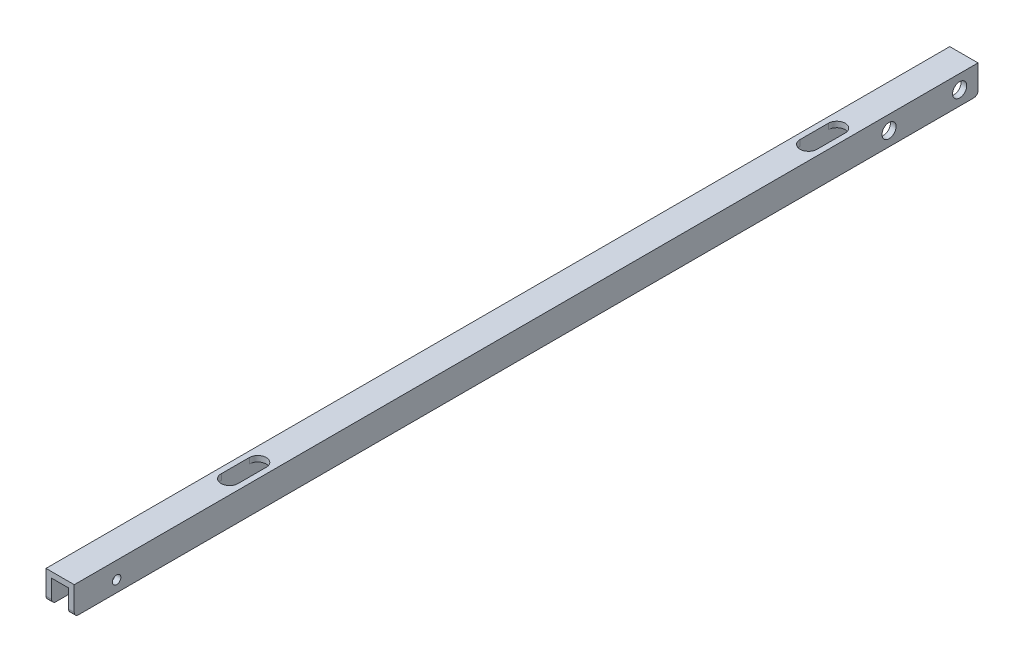
ISO-10303-21;
HEADER;
FILE_DESCRIPTION(('STEP AP214'),'2;1');
FILE_NAME('part.step','',(''),(''),'','','');
FILE_SCHEMA(('AUTOMOTIVE_DESIGN { 1 0 10303 214 1 1 1 1 }'));
ENDSEC;
DATA;
#1=APPLICATION_CONTEXT('core data for automotive mechanical design processes');
#2=APPLICATION_PROTOCOL_DEFINITION('international standard','automotive_design',2000,#1);
#3=PRODUCT_CONTEXT('',#1,'mechanical');
#4=PRODUCT('Part','Part','',(#3));
#5=PRODUCT_RELATED_PRODUCT_CATEGORY('part','',(#4));
#6=PRODUCT_DEFINITION_FORMATION('','',#4);
#7=PRODUCT_DEFINITION_CONTEXT('part definition',#1,'design');
#8=PRODUCT_DEFINITION('design','',#6,#7);
#9=PRODUCT_DEFINITION_SHAPE('','',#8);
#10=(LENGTH_UNIT() NAMED_UNIT(*) SI_UNIT(.MILLI.,.METRE.));
#11=(NAMED_UNIT(*) PLANE_ANGLE_UNIT() SI_UNIT($,.RADIAN.));
#12=(NAMED_UNIT(*) SI_UNIT($,.STERADIAN.) SOLID_ANGLE_UNIT());
#13=UNCERTAINTY_MEASURE_WITH_UNIT(LENGTH_MEASURE(1.E-05),#10,'distance_accuracy_value','');
#14=(GEOMETRIC_REPRESENTATION_CONTEXT(3) GLOBAL_UNCERTAINTY_ASSIGNED_CONTEXT((#13)) GLOBAL_UNIT_ASSIGNED_CONTEXT((#10,
#11,#12)) REPRESENTATION_CONTEXT('',''));
#15=CARTESIAN_POINT('',(0.,0.,0.));
#16=DIRECTION('',(0.,0.,1.));
#17=DIRECTION('',(1.,0.,0.));
#18=AXIS2_PLACEMENT_3D('',#15,#16,#17);
#19=CARTESIAN_POINT('',(0.,8.00000000000001,-400.));
#20=DIRECTION('',(0.,-1.,0.));
#21=DIRECTION('',(0.,0.,-1.));
#22=AXIS2_PLACEMENT_3D('',#19,#20,#21);
#23=PLANE('',#22);
#24=DIRECTION('',(1.,0.,0.));
#25=VECTOR('',#24,1.);
#26=CARTESIAN_POINT('',(8.,8.00000000000001,-261.190628300376));
#27=LINE('',#26,#25);
#28=CARTESIAN_POINT('',(2.,8.00000000000001,-261.190628300376));
#29=VERTEX_POINT('',#28);
#30=CARTESIAN_POINT('',(8.,8.00000000000001,-261.190628300376));
#31=VERTEX_POINT('',#30);
#32=EDGE_CURVE('E47',#29,#31,#27,.T.);
#33=ORIENTED_EDGE('',*,*,#32,.F.);
#34=DIRECTION('',(0.,0.,1.));
#35=VECTOR('',#34,1.);
#36=CARTESIAN_POINT('',(2.,8.00000000000001,-400.));
#37=LINE('',#36,#35);
#38=CARTESIAN_POINT('',(2.,8.00000000000001,-265.));
#39=VERTEX_POINT('',#38);
#40=EDGE_CURVE('E931',#39,#29,#37,.T.);
#41=ORIENTED_EDGE('',*,*,#40,.F.);
#42=CARTESIAN_POINT('',(5.00000000000001,8.00000000000001,-265.));
#43=DIRECTION('',(0.,-1.,0.));
#44=DIRECTION('',(0.,0.,-1.));
#45=AXIS2_PLACEMENT_3D('',#42,#43,#44);
#46=CIRCLE('',#45,3.);
#47=CARTESIAN_POINT('',(8.,8.00000000000001,-265.));
#48=VERTEX_POINT('',#47);
#49=EDGE_CURVE('E388',#39,#48,#46,.F.);
#50=ORIENTED_EDGE('',*,*,#49,.T.);
#51=DIRECTION('',(0.,0.,1.));
#52=VECTOR('',#51,1.);
#53=CARTESIAN_POINT('',(8.,8.00000000000001,-400.));
#54=LINE('',#53,#52);
#55=EDGE_CURVE('E579',#48,#31,#54,.T.);
#56=ORIENTED_EDGE('',*,*,#55,.T.);
#57=EDGE_LOOP('',(#33,#41,#50,#56));
#58=FACE_BOUND('',#57,.T.);
#59=ADVANCED_FACE('F32',(#58),#23,.T.);
#60=DIRECTION('',(-1.,0.,0.));
#61=VECTOR('',#60,1.);
#62=CARTESIAN_POINT('',(8.,8.00000000000001,-246.190628300376));
#63=LINE('',#62,#61);
#64=CARTESIAN_POINT('',(8.,8.00000000000001,-246.190628300376));
#65=VERTEX_POINT('',#64);
#66=CARTESIAN_POINT('',(2.,8.00000000000001,-246.190628300376));
#67=VERTEX_POINT('',#66);
#68=EDGE_CURVE('E256',#65,#67,#63,.T.);
#69=ORIENTED_EDGE('',*,*,#68,.F.);
#70=CARTESIAN_POINT('',(8.,8.00000000000001,-89.2107917821869));
#71=VERTEX_POINT('',#70);
#72=EDGE_CURVE('E238',#65,#71,#54,.T.);
#73=ORIENTED_EDGE('',*,*,#72,.T.);
#74=DIRECTION('',(1.,0.,0.));
#75=VECTOR('',#74,1.);
#76=CARTESIAN_POINT('',(2.06341406420052E-13,8.00000000000001,-89.2107917821869));
#77=LINE('',#76,#75);
#78=CARTESIAN_POINT('',(2.,8.00000000000001,-89.2107917821869));
#79=VERTEX_POINT('',#78);
#80=EDGE_CURVE('E272',#79,#71,#77,.T.);
#81=ORIENTED_EDGE('',*,*,#80,.F.);
#82=EDGE_CURVE('E306',#67,#79,#37,.T.);
#83=ORIENTED_EDGE('',*,*,#82,.F.);
#84=EDGE_LOOP('',(#69,#73,#81,#83));
#85=FACE_BOUND('',#84,.T.);
#86=ADVANCED_FACE('F546',(#85),#23,.T.);
#87=CARTESIAN_POINT('',(10.,0.,0.));
#88=DIRECTION('',(0.,1.,0.));
#89=DIRECTION('',(0.,0.,1.));
#90=AXIS2_PLACEMENT_3D('',#87,#88,#89);
#91=PLANE('',#90);
#92=DIRECTION('',(0.,0.,-1.));
#93=VECTOR('',#92,1.);
#94=CARTESIAN_POINT('',(10.,0.,0.));
#95=LINE('',#94,#93);
#96=CARTESIAN_POINT('',(10.,0.,-1.5));
#97=VERTEX_POINT('',#96);
#98=CARTESIAN_POINT('',(10.,0.,-318.5));
#99=VERTEX_POINT('',#98);
#100=EDGE_CURVE('E506',#97,#99,#95,.T.);
#101=ORIENTED_EDGE('',*,*,#100,.F.);
#102=DIRECTION('',(-1.,0.,0.));
#103=VECTOR('',#102,1.);
#104=CARTESIAN_POINT('',(10.,0.,-1.5));
#105=LINE('',#104,#103);
#106=CARTESIAN_POINT('',(8.00000000000001,0.,-1.5));
#107=VERTEX_POINT('',#106);
#108=EDGE_CURVE('E447',#97,#107,#105,.T.);
#109=ORIENTED_EDGE('',*,*,#108,.T.);
#110=DIRECTION('',(0.,0.,-1.));
#111=VECTOR('',#110,1.);
#112=CARTESIAN_POINT('',(8.00000000000001,0.,0.));
#113=LINE('',#112,#111);
#114=CARTESIAN_POINT('',(8.00000000000001,0.,-318.5));
#115=VERTEX_POINT('',#114);
#116=EDGE_CURVE('E489',#107,#115,#113,.T.);
#117=ORIENTED_EDGE('',*,*,#116,.T.);
#118=DIRECTION('',(-1.,0.,0.));
#119=VECTOR('',#118,1.);
#120=CARTESIAN_POINT('',(10.,0.,-318.5));
#121=LINE('',#120,#119);
#122=EDGE_CURVE('E442',#115,#99,#121,.F.);
#123=ORIENTED_EDGE('',*,*,#122,.T.);
#124=EDGE_LOOP('',(#101,#109,#117,#123));
#125=FACE_BOUND('',#124,.T.);
#126=ADVANCED_FACE('F542',(#125),#91,.F.);
#127=CARTESIAN_POINT('',(10.,0.,0.));
#128=DIRECTION('',(0.,0.,-1.));
#129=DIRECTION('',(-1.,0.,0.));
#130=AXIS2_PLACEMENT_3D('',#127,#128,#129);
#131=PLANE('',#130);
#132=DIRECTION('',(0.,-1.,0.));
#133=VECTOR('',#132,1.);
#134=CARTESIAN_POINT('',(8.,0.,0.));
#135=LINE('',#134,#133);
#136=CARTESIAN_POINT('',(8.,8.00000000000001,0.));
#137=VERTEX_POINT('',#136);
#138=CARTESIAN_POINT('',(8.,1.5,0.));
#139=VERTEX_POINT('',#138);
#140=EDGE_CURVE('E286',#137,#139,#135,.T.);
#141=ORIENTED_EDGE('',*,*,#140,.T.);
#142=DIRECTION('',(-1.,0.,0.));
#143=VECTOR('',#142,1.);
#144=CARTESIAN_POINT('',(10.,1.5,0.));
#145=LINE('',#144,#143);
#146=CARTESIAN_POINT('',(10.,1.5,0.));
#147=VERTEX_POINT('',#146);
#148=EDGE_CURVE('E454',#139,#147,#145,.F.);
#149=ORIENTED_EDGE('',*,*,#148,.T.);
#150=DIRECTION('',(0.,-1.,0.));
#151=VECTOR('',#150,1.);
#152=CARTESIAN_POINT('',(10.,0.,0.));
#153=LINE('',#152,#151);
#154=CARTESIAN_POINT('',(10.,10.,0.));
#155=VERTEX_POINT('',#154);
#156=EDGE_CURVE('E499',#155,#147,#153,.T.);
#157=ORIENTED_EDGE('',*,*,#156,.F.);
#158=DIRECTION('',(-1.,0.,0.));
#159=VECTOR('',#158,1.);
#160=CARTESIAN_POINT('',(10.,10.,0.));
#161=LINE('',#160,#159);
#162=CARTESIAN_POINT('',(0.,10.,0.));
#163=VERTEX_POINT('',#162);
#164=EDGE_CURVE('E478',#155,#163,#161,.T.);
#165=ORIENTED_EDGE('',*,*,#164,.T.);
#166=DIRECTION('',(0.,-1.,0.));
#167=VECTOR('',#166,1.);
#168=CARTESIAN_POINT('',(0.,0.,0.));
#169=LINE('',#168,#167);
#170=CARTESIAN_POINT('',(0.,1.5,0.));
#171=VERTEX_POINT('',#170);
#172=EDGE_CURVE('E467',#163,#171,#169,.T.);
#173=ORIENTED_EDGE('',*,*,#172,.T.);
#174=DIRECTION('',(-1.,0.,0.));
#175=VECTOR('',#174,1.);
#176=CARTESIAN_POINT('',(10.,1.5,0.));
#177=LINE('',#176,#175);
#178=CARTESIAN_POINT('',(2.,1.5,0.));
#179=VERTEX_POINT('',#178);
#180=EDGE_CURVE('E452',#171,#179,#177,.F.);
#181=ORIENTED_EDGE('',*,*,#180,.T.);
#182=DIRECTION('',(0.,-1.,0.));
#183=VECTOR('',#182,1.);
#184=CARTESIAN_POINT('',(2.,0.,0.));
#185=LINE('',#184,#183);
#186=CARTESIAN_POINT('',(2.,8.00000000000001,0.));
#187=VERTEX_POINT('',#186);
#188=EDGE_CURVE('E298',#187,#179,#185,.T.);
#189=ORIENTED_EDGE('',*,*,#188,.F.);
#190=DIRECTION('',(1.,0.,0.));
#191=VECTOR('',#190,1.);
#192=CARTESIAN_POINT('',(0.,8.00000000000001,0.));
#193=LINE('',#192,#191);
#194=EDGE_CURVE('E295',#187,#137,#193,.T.);
#195=ORIENTED_EDGE('',*,*,#194,.T.);
#196=EDGE_LOOP('',(#141,#149,#157,#165,#173,#181,#189,#195));
#197=FACE_BOUND('',#196,.T.);
#198=ADVANCED_FACE('F474',(#197),#131,.F.);
#199=CARTESIAN_POINT('',(10.,0.,-320.));
#200=DIRECTION('',(0.,0.,1.));
#201=DIRECTION('',(0.,-1.,0.));
#202=AXIS2_PLACEMENT_3D('',#199,#200,#201);
#203=PLANE('',#202);
#204=DIRECTION('',(0.,-1.,0.));
#205=VECTOR('',#204,1.);
#206=CARTESIAN_POINT('',(2.,0.,-320.));
#207=LINE('',#206,#205);
#208=CARTESIAN_POINT('',(2.,8.00000000000001,-320.));
#209=VERTEX_POINT('',#208);
#210=CARTESIAN_POINT('',(2.,1.49999999999999,-320.));
#211=VERTEX_POINT('',#210);
#212=EDGE_CURVE('E594',#209,#211,#207,.T.);
#213=ORIENTED_EDGE('',*,*,#212,.T.);
#214=DIRECTION('',(-1.,0.,0.));
#215=VECTOR('',#214,1.);
#216=CARTESIAN_POINT('',(10.,1.49999999999999,-320.));
#217=LINE('',#216,#215);
#218=CARTESIAN_POINT('',(0.,1.49999999999999,-320.));
#219=VERTEX_POINT('',#218);
#220=EDGE_CURVE('E428',#211,#219,#217,.T.);
#221=ORIENTED_EDGE('',*,*,#220,.T.);
#222=DIRECTION('',(0.,1.,0.));
#223=VECTOR('',#222,1.);
#224=CARTESIAN_POINT('',(0.,0.,-320.));
#225=LINE('',#224,#223);
#226=CARTESIAN_POINT('',(0.,10.,-320.));
#227=VERTEX_POINT('',#226);
#228=EDGE_CURVE('E500',#219,#227,#225,.T.);
#229=ORIENTED_EDGE('',*,*,#228,.T.);
#230=DIRECTION('',(-1.,0.,0.));
#231=VECTOR('',#230,1.);
#232=CARTESIAN_POINT('',(10.,10.,-320.));
#233=LINE('',#232,#231);
#234=CARTESIAN_POINT('',(10.,10.,-320.));
#235=VERTEX_POINT('',#234);
#236=EDGE_CURVE('E490',#235,#227,#233,.T.);
#237=ORIENTED_EDGE('',*,*,#236,.F.);
#238=DIRECTION('',(0.,1.,0.));
#239=VECTOR('',#238,1.);
#240=CARTESIAN_POINT('',(10.,0.,-320.));
#241=LINE('',#240,#239);
#242=CARTESIAN_POINT('',(10.,1.49999999999999,-320.));
#243=VERTEX_POINT('',#242);
#244=EDGE_CURVE('E504',#243,#235,#241,.T.);
#245=ORIENTED_EDGE('',*,*,#244,.F.);
#246=DIRECTION('',(-1.,0.,0.));
#247=VECTOR('',#246,1.);
#248=CARTESIAN_POINT('',(10.,1.49999999999999,-320.));
#249=LINE('',#248,#247);
#250=CARTESIAN_POINT('',(8.,1.49999999999999,-320.));
#251=VERTEX_POINT('',#250);
#252=EDGE_CURVE('E420',#243,#251,#249,.T.);
#253=ORIENTED_EDGE('',*,*,#252,.T.);
#254=DIRECTION('',(0.,-1.,0.));
#255=VECTOR('',#254,1.);
#256=CARTESIAN_POINT('',(8.,0.,-320.));
#257=LINE('',#256,#255);
#258=CARTESIAN_POINT('',(8.,8.00000000000001,-320.));
#259=VERTEX_POINT('',#258);
#260=EDGE_CURVE('E334',#259,#251,#257,.T.);
#261=ORIENTED_EDGE('',*,*,#260,.F.);
#262=DIRECTION('',(1.,0.,0.));
#263=VECTOR('',#262,1.);
#264=CARTESIAN_POINT('',(10.,8.00000000000001,-320.));
#265=LINE('',#264,#263);
#266=EDGE_CURVE('E322',#209,#259,#265,.T.);
#267=ORIENTED_EDGE('',*,*,#266,.F.);
#268=EDGE_LOOP('',(#213,#221,#229,#237,#245,#253,#261,#267));
#269=FACE_BOUND('',#268,.T.);
#270=ADVANCED_FACE('F580',(#269),#203,.F.);
#271=CARTESIAN_POINT('',(10.,4.,-15.));
#272=DIRECTION('',(-1.,0.,0.));
#273=DIRECTION('',(0.,0.,1.));
#274=AXIS2_PLACEMENT_3D('',#271,#272,#273);
#275=CYLINDRICAL_SURFACE('',#274,1.5);
#276=CARTESIAN_POINT('',(10.,4.,-15.));
#277=DIRECTION('',(1.,0.,0.));
#278=DIRECTION('',(0.,0.,-1.));
#279=AXIS2_PLACEMENT_3D('',#276,#277,#278);
#280=CIRCLE('',#279,1.5);
#281=CARTESIAN_POINT('',(10.,4.,-16.5));
#282=VERTEX_POINT('',#281);
#283=EDGE_CURVE('E479',#282,#282,#280,.T.);
#284=ORIENTED_EDGE('',*,*,#283,.T.);
#285=EDGE_LOOP('',(#284));
#286=FACE_BOUND('',#285,.T.);
#287=CARTESIAN_POINT('',(8.,4.,-15.));
#288=DIRECTION('',(-1.,0.,0.));
#289=DIRECTION('',(0.,0.,1.));
#290=AXIS2_PLACEMENT_3D('',#287,#288,#289);
#291=CIRCLE('',#290,1.5);
#292=CARTESIAN_POINT('',(8.,4.,-13.5));
#293=VERTEX_POINT('',#292);
#294=EDGE_CURVE('E583',#293,#293,#291,.T.);
#295=ORIENTED_EDGE('',*,*,#294,.T.);
#296=EDGE_LOOP('',(#295));
#297=FACE_BOUND('',#296,.T.);
#298=ADVANCED_FACE('F623',(#286,#297),#275,.F.);
#299=CARTESIAN_POINT('',(10.,5.,-313.5));
#300=DIRECTION('',(-1.,0.,0.));
#301=DIRECTION('',(0.,0.,1.));
#302=AXIS2_PLACEMENT_3D('',#299,#300,#301);
#303=CYLINDRICAL_SURFACE('',#302,2.50000000000002);
#304=CARTESIAN_POINT('',(10.,5.,-313.5));
#305=DIRECTION('',(1.,0.,0.));
#306=DIRECTION('',(0.,0.,-1.));
#307=AXIS2_PLACEMENT_3D('',#304,#305,#306);
#308=CIRCLE('',#307,2.50000000000002);
#309=CARTESIAN_POINT('',(10.,5.,-316.));
#310=VERTEX_POINT('',#309);
#311=EDGE_CURVE('E513',#310,#310,#308,.T.);
#312=ORIENTED_EDGE('',*,*,#311,.T.);
#313=EDGE_LOOP('',(#312));
#314=FACE_BOUND('',#313,.T.);
#315=CARTESIAN_POINT('',(8.,5.,-313.5));
#316=DIRECTION('',(-1.,0.,0.));
#317=DIRECTION('',(0.,0.,1.));
#318=AXIS2_PLACEMENT_3D('',#315,#316,#317);
#319=CIRCLE('',#318,2.50000000000002);
#320=CARTESIAN_POINT('',(8.,5.,-311.));
#321=VERTEX_POINT('',#320);
#322=EDGE_CURVE('E585',#321,#321,#319,.T.);
#323=ORIENTED_EDGE('',*,*,#322,.T.);
#324=EDGE_LOOP('',(#323));
#325=FACE_BOUND('',#324,.T.);
#326=ADVANCED_FACE('F613',(#314,#325),#303,.F.);
#327=CARTESIAN_POINT('',(10.,5.,-288.5));
#328=DIRECTION('',(-1.,0.,0.));
#329=DIRECTION('',(0.,0.,1.));
#330=AXIS2_PLACEMENT_3D('',#327,#328,#329);
#331=CYLINDRICAL_SURFACE('',#330,2.50000000000002);
#332=CARTESIAN_POINT('',(10.,5.,-288.5));
#333=DIRECTION('',(1.,0.,0.));
#334=DIRECTION('',(0.,0.,-1.));
#335=AXIS2_PLACEMENT_3D('',#332,#333,#334);
#336=CIRCLE('',#335,2.50000000000002);
#337=CARTESIAN_POINT('',(10.,5.,-291.));
#338=VERTEX_POINT('',#337);
#339=EDGE_CURVE('E383',#338,#338,#336,.T.);
#340=ORIENTED_EDGE('',*,*,#339,.T.);
#341=EDGE_LOOP('',(#340));
#342=FACE_BOUND('',#341,.T.);
#343=CARTESIAN_POINT('',(8.,5.,-288.5));
#344=DIRECTION('',(-1.,0.,0.));
#345=DIRECTION('',(0.,0.,1.));
#346=AXIS2_PLACEMENT_3D('',#343,#344,#345);
#347=CIRCLE('',#346,2.50000000000002);
#348=CARTESIAN_POINT('',(8.,5.,-286.));
#349=VERTEX_POINT('',#348);
#350=EDGE_CURVE('E589',#349,#349,#347,.T.);
#351=ORIENTED_EDGE('',*,*,#350,.T.);
#352=EDGE_LOOP('',(#351));
#353=FACE_BOUND('',#352,.T.);
#354=ADVANCED_FACE('F526',(#342,#353),#331,.F.);
#355=CARTESIAN_POINT('',(5.,7.95158630360233,-70.));
#356=DIRECTION('',(0.,1.,0.));
#357=DIRECTION('',(0.,0.,1.));
#358=AXIS2_PLACEMENT_3D('',#355,#356,#357);
#359=CYLINDRICAL_SURFACE('',#358,3.);
#360=CARTESIAN_POINT('',(5.,8.00000000000001,-70.));
#361=DIRECTION('',(0.,-1.,0.));
#362=DIRECTION('',(0.,0.,-1.));
#363=AXIS2_PLACEMENT_3D('',#360,#361,#362);
#364=CIRCLE('',#363,3.);
#365=CARTESIAN_POINT('',(8.,8.00000000000001,-70.));
#366=VERTEX_POINT('',#365);
#367=CARTESIAN_POINT('',(2.,8.00000000000001,-70.));
#368=VERTEX_POINT('',#367);
#369=EDGE_CURVE('E319',#366,#368,#364,.F.);
#370=ORIENTED_EDGE('',*,*,#369,.F.);
#371=DIRECTION('',(0.,1.,0.));
#372=VECTOR('',#371,1.);
#373=CARTESIAN_POINT('',(8.,7.95158630360233,-70.));
#374=LINE('',#373,#372);
#375=CARTESIAN_POINT('',(8.,10.,-70.));
#376=VERTEX_POINT('',#375);
#377=EDGE_CURVE('E375',#366,#376,#374,.T.);
#378=ORIENTED_EDGE('',*,*,#377,.T.);
#379=CARTESIAN_POINT('',(5.,10.,-70.));
#380=DIRECTION('',(0.,1.,0.));
#381=DIRECTION('',(0.,0.,1.));
#382=AXIS2_PLACEMENT_3D('',#379,#380,#381);
#383=CIRCLE('',#382,3.);
#384=CARTESIAN_POINT('',(2.,10.,-70.));
#385=VERTEX_POINT('',#384);
#386=EDGE_CURVE('E368',#376,#385,#383,.T.);
#387=ORIENTED_EDGE('',*,*,#386,.T.);
#388=DIRECTION('',(0.,1.,0.));
#389=VECTOR('',#388,1.);
#390=CARTESIAN_POINT('',(2.,7.95158630360233,-70.));
#391=LINE('',#390,#389);
#392=EDGE_CURVE('E372',#368,#385,#391,.T.);
#393=ORIENTED_EDGE('',*,*,#392,.F.);
#394=EDGE_LOOP('',(#370,#378,#387,#393));
#395=FACE_BOUND('',#394,.T.);
#396=ADVANCED_FACE('F615',(#395),#359,.F.);
#397=CARTESIAN_POINT('',(0.,7.95158630360233,-70.));
#398=DIRECTION('',(0.,0.,1.));
#399=DIRECTION('',(1.,0.,0.));
#400=AXIS2_PLACEMENT_3D('',#397,#398,#399);
#401=PLANE('',#400);
#402=DIRECTION('',(1.,0.,0.));
#403=VECTOR('',#402,1.);
#404=CARTESIAN_POINT('',(0.,8.00000000000001,-70.));
#405=LINE('',#404,#403);
#406=CARTESIAN_POINT('',(7.99555809643483,8.00000000000001,-70.));
#407=VERTEX_POINT('',#406);
#408=EDGE_CURVE('E316',#407,#366,#405,.T.);
#409=ORIENTED_EDGE('',*,*,#408,.F.);
#410=DIRECTION('',(0.,1.,0.));
#411=VECTOR('',#410,1.);
#412=CARTESIAN_POINT('',(7.99555809643483,7.95158630360233,-70.));
#413=LINE('',#412,#411);
#414=CARTESIAN_POINT('',(7.99555809643483,10.,-70.));
#415=VERTEX_POINT('',#414);
#416=EDGE_CURVE('E377',#407,#415,#413,.T.);
#417=ORIENTED_EDGE('',*,*,#416,.T.);
#418=DIRECTION('',(1.,0.,0.));
#419=VECTOR('',#418,1.);
#420=CARTESIAN_POINT('',(0.,10.,-70.));
#421=LINE('',#420,#419);
#422=EDGE_CURVE('E365',#415,#376,#421,.T.);
#423=ORIENTED_EDGE('',*,*,#422,.T.);
#424=ORIENTED_EDGE('',*,*,#377,.F.);
#425=EDGE_LOOP('',(#409,#417,#423,#424));
#426=FACE_BOUND('',#425,.T.);
#427=ADVANCED_FACE('F620',(#426),#401,.F.);
#428=CARTESIAN_POINT('',(7.99555809643483,7.95158630360233,0.));
#429=DIRECTION('',(1.,0.,0.));
#430=DIRECTION('',(0.,0.,-1.));
#431=AXIS2_PLACEMENT_3D('',#428,#429,#430);
#432=PLANE('',#431);
#433=DIRECTION('',(0.,0.,-1.));
#434=VECTOR('',#433,1.);
#435=CARTESIAN_POINT('',(7.99555809643483,8.00000000000001,0.));
#436=LINE('',#435,#434);
#437=CARTESIAN_POINT('',(7.99555809643483,8.00000000000001,-60.));
#438=VERTEX_POINT('',#437);
#439=EDGE_CURVE('E314',#438,#407,#436,.T.);
#440=ORIENTED_EDGE('',*,*,#439,.F.);
#441=DIRECTION('',(0.,1.,0.));
#442=VECTOR('',#441,1.);
#443=CARTESIAN_POINT('',(7.99555809643483,7.95158630360233,-60.));
#444=LINE('',#443,#442);
#445=CARTESIAN_POINT('',(7.99555809643483,10.,-60.));
#446=VERTEX_POINT('',#445);
#447=EDGE_CURVE('E379',#438,#446,#444,.T.);
#448=ORIENTED_EDGE('',*,*,#447,.T.);
#449=DIRECTION('',(0.,0.,-1.));
#450=VECTOR('',#449,1.);
#451=CARTESIAN_POINT('',(7.99555809643483,10.,0.));
#452=LINE('',#451,#450);
#453=EDGE_CURVE('E362',#446,#415,#452,.T.);
#454=ORIENTED_EDGE('',*,*,#453,.T.);
#455=ORIENTED_EDGE('',*,*,#416,.F.);
#456=EDGE_LOOP('',(#440,#448,#454,#455));
#457=FACE_BOUND('',#456,.T.);
#458=ADVANCED_FACE('F409',(#457),#432,.F.);
#459=CARTESIAN_POINT('',(5.00000000000001,-20.,-275.));
#460=DIRECTION('',(0.,1.,0.));
#461=DIRECTION('',(0.,0.,1.));
#462=AXIS2_PLACEMENT_3D('',#459,#460,#461);
#463=CYLINDRICAL_SURFACE('',#462,3.);
#464=CARTESIAN_POINT('',(5.00000000000001,8.00000000000001,-275.));
#465=DIRECTION('',(0.,-1.,0.));
#466=DIRECTION('',(0.,0.,-1.));
#467=AXIS2_PLACEMENT_3D('',#464,#465,#466);
#468=CIRCLE('',#467,3.);
#469=CARTESIAN_POINT('',(8.00000000000001,8.00000000000001,-275.));
#470=VERTEX_POINT('',#469);
#471=CARTESIAN_POINT('',(2.,8.00000000000001,-275.));
#472=VERTEX_POINT('',#471);
#473=EDGE_CURVE('E310',#470,#472,#468,.F.);
#474=ORIENTED_EDGE('',*,*,#473,.F.);
#475=DIRECTION('',(0.,1.,0.));
#476=VECTOR('',#475,1.);
#477=CARTESIAN_POINT('',(8.00000000000001,-20.,-275.));
#478=LINE('',#477,#476);
#479=CARTESIAN_POINT('',(8.00000000000001,10.,-275.));
#480=VERTEX_POINT('',#479);
#481=EDGE_CURVE('E352',#470,#480,#478,.T.);
#482=ORIENTED_EDGE('',*,*,#481,.T.);
#483=CARTESIAN_POINT('',(5.00000000000001,10.,-275.));
#484=DIRECTION('',(0.,1.,0.));
#485=DIRECTION('',(0.,0.,1.));
#486=AXIS2_PLACEMENT_3D('',#483,#484,#485);
#487=CIRCLE('',#486,3.);
#488=CARTESIAN_POINT('',(2.,10.,-275.));
#489=VERTEX_POINT('',#488);
#490=EDGE_CURVE('E345',#480,#489,#487,.T.);
#491=ORIENTED_EDGE('',*,*,#490,.T.);
#492=DIRECTION('',(0.,1.,0.));
#493=VECTOR('',#492,1.);
#494=CARTESIAN_POINT('',(2.,-20.,-275.));
#495=LINE('',#494,#493);
#496=EDGE_CURVE('E349',#472,#489,#495,.T.);
#497=ORIENTED_EDGE('',*,*,#496,.F.);
#498=EDGE_LOOP('',(#474,#482,#491,#497));
#499=FACE_BOUND('',#498,.T.);
#500=ADVANCED_FACE('F864',(#499),#463,.F.);
#501=CARTESIAN_POINT('',(5.00000000000001,-20.,-265.));
#502=DIRECTION('',(0.,1.,0.));
#503=DIRECTION('',(0.,0.,1.));
#504=AXIS2_PLACEMENT_3D('',#501,#502,#503);
#505=CYLINDRICAL_SURFACE('',#504,3.);
#506=ORIENTED_EDGE('',*,*,#49,.F.);
#507=DIRECTION('',(0.,1.,0.));
#508=VECTOR('',#507,1.);
#509=CARTESIAN_POINT('',(2.,-20.,-265.));
#510=LINE('',#509,#508);
#511=CARTESIAN_POINT('',(2.00000000000001,10.,-265.));
#512=VERTEX_POINT('',#511);
#513=EDGE_CURVE('E348',#39,#512,#510,.T.);
#514=ORIENTED_EDGE('',*,*,#513,.T.);
#515=CARTESIAN_POINT('',(5.00000000000001,10.,-265.));
#516=DIRECTION('',(0.,1.,0.));
#517=DIRECTION('',(0.,0.,1.));
#518=AXIS2_PLACEMENT_3D('',#515,#516,#517);
#519=CIRCLE('',#518,3.);
#520=CARTESIAN_POINT('',(8.00000000000001,10.,-265.));
#521=VERTEX_POINT('',#520);
#522=EDGE_CURVE('E339',#512,#521,#519,.T.);
#523=ORIENTED_EDGE('',*,*,#522,.T.);
#524=DIRECTION('',(0.,1.,0.));
#525=VECTOR('',#524,1.);
#526=CARTESIAN_POINT('',(8.00000000000001,-20.,-265.));
#527=LINE('',#526,#525);
#528=EDGE_CURVE('E354',#48,#521,#527,.T.);
#529=ORIENTED_EDGE('',*,*,#528,.F.);
#530=EDGE_LOOP('',(#506,#514,#523,#529));
#531=FACE_BOUND('',#530,.T.);
#532=ADVANCED_FACE('F859',(#531),#505,.F.);
#533=CARTESIAN_POINT('',(10.,10.,0.));
#534=DIRECTION('',(0.,-1.,0.));
#535=DIRECTION('',(0.,0.,-1.));
#536=AXIS2_PLACEMENT_3D('',#533,#534,#535);
#537=PLANE('',#536);
#538=DIRECTION('',(0.,0.,-1.));
#539=VECTOR('',#538,1.);
#540=CARTESIAN_POINT('',(2.,10.,0.));
#541=LINE('',#540,#539);
#542=CARTESIAN_POINT('',(2.,10.,-60.1631921900207));
#543=VERTEX_POINT('',#542);
#544=EDGE_CURVE('E351',#543,#385,#541,.T.);
#545=ORIENTED_EDGE('',*,*,#544,.T.);
#546=ORIENTED_EDGE('',*,*,#386,.F.);
#547=ORIENTED_EDGE('',*,*,#422,.F.);
#548=ORIENTED_EDGE('',*,*,#453,.F.);
#549=CARTESIAN_POINT('',(4.99555809643483,10.,-60.));
#550=DIRECTION('',(0.,1.,0.));
#551=DIRECTION('',(0.,0.,1.));
#552=AXIS2_PLACEMENT_3D('',#549,#550,#551);
#553=CIRCLE('',#552,3.);
#554=EDGE_CURVE('E359',#543,#446,#553,.T.);
#555=ORIENTED_EDGE('',*,*,#554,.F.);
#556=EDGE_LOOP('',(#545,#546,#547,#548,#555));
#557=FACE_BOUND('',#556,.T.);
#558=DIRECTION('',(0.,0.,1.));
#559=VECTOR('',#558,1.);
#560=CARTESIAN_POINT('',(0.,10.,0.));
#561=LINE('',#560,#559);
#562=EDGE_CURVE('E497',#227,#163,#561,.T.);
#563=ORIENTED_EDGE('',*,*,#562,.T.);
#564=ORIENTED_EDGE('',*,*,#164,.F.);
#565=DIRECTION('',(0.,0.,1.));
#566=VECTOR('',#565,1.);
#567=CARTESIAN_POINT('',(10.,10.,0.));
#568=LINE('',#567,#566);
#569=EDGE_CURVE('E496',#235,#155,#568,.T.);
#570=ORIENTED_EDGE('',*,*,#569,.F.);
#571=ORIENTED_EDGE('',*,*,#236,.T.);
#572=EDGE_LOOP('',(#563,#564,#570,#571));
#573=FACE_BOUND('',#572,.T.);
#574=DIRECTION('',(0.,0.,-1.));
#575=VECTOR('',#574,1.);
#576=CARTESIAN_POINT('',(2.,10.,0.));
#577=LINE('',#576,#575);
#578=EDGE_CURVE('E336',#512,#489,#577,.T.);
#579=ORIENTED_EDGE('',*,*,#578,.T.);
#580=ORIENTED_EDGE('',*,*,#490,.F.);
#581=DIRECTION('',(0.,0.,-1.));
#582=VECTOR('',#581,1.);
#583=CARTESIAN_POINT('',(8.00000000000001,10.,0.));
#584=LINE('',#583,#582);
#585=EDGE_CURVE('E342',#521,#480,#584,.T.);
#586=ORIENTED_EDGE('',*,*,#585,.F.);
#587=ORIENTED_EDGE('',*,*,#522,.F.);
#588=EDGE_LOOP('',(#579,#580,#586,#587));
#589=FACE_BOUND('',#588,.T.);
#590=ADVANCED_FACE('F540',(#557,#573,#589),#537,.F.);
#591=DIRECTION('',(0.,0.,-1.));
#592=VECTOR('',#591,1.);
#593=CARTESIAN_POINT('',(2.,0.,0.));
#594=LINE('',#593,#592);
#595=CARTESIAN_POINT('',(2.,0.,-1.5));
#596=VERTEX_POINT('',#595);
#597=CARTESIAN_POINT('',(2.,0.,-318.5));
#598=VERTEX_POINT('',#597);
#599=EDGE_CURVE('E484',#596,#598,#594,.T.);
#600=ORIENTED_EDGE('',*,*,#599,.F.);
#601=DIRECTION('',(-1.,0.,0.));
#602=VECTOR('',#601,1.);
#603=CARTESIAN_POINT('',(10.,0.,-1.5));
#604=LINE('',#603,#602);
#605=CARTESIAN_POINT('',(0.,0.,-1.5));
#606=VERTEX_POINT('',#605);
#607=EDGE_CURVE('E458',#596,#606,#604,.T.);
#608=ORIENTED_EDGE('',*,*,#607,.T.);
#609=DIRECTION('',(0.,0.,-1.));
#610=VECTOR('',#609,1.);
#611=CARTESIAN_POINT('',(0.,0.,0.));
#612=LINE('',#611,#610);
#613=CARTESIAN_POINT('',(0.,0.,-318.5));
#614=VERTEX_POINT('',#613);
#615=EDGE_CURVE('E468',#606,#614,#612,.T.);
#616=ORIENTED_EDGE('',*,*,#615,.T.);
#617=DIRECTION('',(-1.,0.,0.));
#618=VECTOR('',#617,1.);
#619=CARTESIAN_POINT('',(10.,0.,-318.5));
#620=LINE('',#619,#618);
#621=EDGE_CURVE('E434',#614,#598,#620,.F.);
#622=ORIENTED_EDGE('',*,*,#621,.T.);
#623=EDGE_LOOP('',(#600,#608,#616,#622));
#624=FACE_BOUND('',#623,.T.);
#625=ADVANCED_FACE('F486',(#624),#91,.F.);
#626=CARTESIAN_POINT('',(10.,0.,0.));
#627=DIRECTION('',(-1.,0.,0.));
#628=DIRECTION('',(0.,0.,1.));
#629=AXIS2_PLACEMENT_3D('',#626,#627,#628);
#630=PLANE('',#629);
#631=ORIENTED_EDGE('',*,*,#156,.T.);
#632=CARTESIAN_POINT('',(10.,1.5,-1.5));
#633=DIRECTION('',(-1.,0.,0.));
#634=DIRECTION('',(0.,0.,1.));
#635=AXIS2_PLACEMENT_3D('',#632,#633,#634);
#636=CIRCLE('',#635,1.5);
#637=EDGE_CURVE('E456',#147,#97,#636,.F.);
#638=ORIENTED_EDGE('',*,*,#637,.T.);
#639=ORIENTED_EDGE('',*,*,#100,.T.);
#640=CARTESIAN_POINT('',(10.,1.5,-318.5));
#641=DIRECTION('',(-1.,0.,0.));
#642=DIRECTION('',(0.,0.,1.));
#643=AXIS2_PLACEMENT_3D('',#640,#641,#642);
#644=CIRCLE('',#643,1.5);
#645=EDGE_CURVE('E445',#99,#243,#644,.F.);
#646=ORIENTED_EDGE('',*,*,#645,.T.);
#647=ORIENTED_EDGE('',*,*,#244,.T.);
#648=ORIENTED_EDGE('',*,*,#569,.T.);
#649=EDGE_LOOP('',(#631,#638,#639,#646,#647,#648));
#650=FACE_BOUND('',#649,.T.);
#651=ORIENTED_EDGE('',*,*,#283,.F.);
#652=EDGE_LOOP('',(#651));
#653=FACE_BOUND('',#652,.T.);
#654=ORIENTED_EDGE('',*,*,#311,.F.);
#655=EDGE_LOOP('',(#654));
#656=FACE_BOUND('',#655,.T.);
#657=ORIENTED_EDGE('',*,*,#339,.F.);
#658=EDGE_LOOP('',(#657));
#659=FACE_BOUND('',#658,.T.);
#660=ADVANCED_FACE('F529',(#650,#653,#656,#659),#630,.F.);
#661=CARTESIAN_POINT('',(0.,0.,0.));
#662=DIRECTION('',(-1.,0.,0.));
#663=DIRECTION('',(0.,0.,1.));
#664=AXIS2_PLACEMENT_3D('',#661,#662,#663);
#665=PLANE('',#664);
#666=CARTESIAN_POINT('',(0.,5.,-313.5));
#667=DIRECTION('',(1.,0.,0.));
#668=DIRECTION('',(0.,0.,-1.));
#669=AXIS2_PLACEMENT_3D('',#666,#667,#668);
#670=CIRCLE('',#669,2.50000000000002);
#671=CARTESIAN_POINT('',(0.,5.,-316.));
#672=VERTEX_POINT('',#671);
#673=EDGE_CURVE('E516',#672,#672,#670,.T.);
#674=ORIENTED_EDGE('',*,*,#673,.T.);
#675=EDGE_LOOP('',(#674));
#676=FACE_BOUND('',#675,.T.);
#677=ORIENTED_EDGE('',*,*,#615,.F.);
#678=CARTESIAN_POINT('',(0.,1.5,-1.5));
#679=DIRECTION('',(-1.,0.,0.));
#680=DIRECTION('',(0.,0.,1.));
#681=AXIS2_PLACEMENT_3D('',#678,#679,#680);
#682=CIRCLE('',#681,1.5);
#683=EDGE_CURVE('E40',#606,#171,#682,.T.);
#684=ORIENTED_EDGE('',*,*,#683,.T.);
#685=ORIENTED_EDGE('',*,*,#172,.F.);
#686=ORIENTED_EDGE('',*,*,#562,.F.);
#687=ORIENTED_EDGE('',*,*,#228,.F.);
#688=CARTESIAN_POINT('',(0.,1.5,-318.5));
#689=DIRECTION('',(-1.,0.,0.));
#690=DIRECTION('',(0.,0.,1.));
#691=AXIS2_PLACEMENT_3D('',#688,#689,#690);
#692=CIRCLE('',#691,1.5);
#693=EDGE_CURVE('E431',#219,#614,#692,.T.);
#694=ORIENTED_EDGE('',*,*,#693,.T.);
#695=EDGE_LOOP('',(#677,#684,#685,#686,#687,#694));
#696=FACE_BOUND('',#695,.T.);
#697=CARTESIAN_POINT('',(0.,4.,-15.));
#698=DIRECTION('',(1.,0.,0.));
#699=DIRECTION('',(0.,0.,-1.));
#700=AXIS2_PLACEMENT_3D('',#697,#698,#699);
#701=CIRCLE('',#700,1.5);
#702=CARTESIAN_POINT('',(0.,4.,-16.5));
#703=VERTEX_POINT('',#702);
#704=EDGE_CURVE('E510',#703,#703,#701,.T.);
#705=ORIENTED_EDGE('',*,*,#704,.T.);
#706=EDGE_LOOP('',(#705));
#707=FACE_BOUND('',#706,.T.);
#708=CARTESIAN_POINT('',(0.,5.,-288.5));
#709=DIRECTION('',(1.,0.,0.));
#710=DIRECTION('',(0.,0.,-1.));
#711=AXIS2_PLACEMENT_3D('',#708,#709,#710);
#712=CIRCLE('',#711,2.50000000000002);
#713=CARTESIAN_POINT('',(0.,5.,-291.));
#714=VERTEX_POINT('',#713);
#715=EDGE_CURVE('E374',#714,#714,#712,.T.);
#716=ORIENTED_EDGE('',*,*,#715,.T.);
#717=EDGE_LOOP('',(#716));
#718=FACE_BOUND('',#717,.T.);
#719=ADVANCED_FACE('F464',(#676,#696,#707,#718),#665,.T.);
#720=CARTESIAN_POINT('',(2.,4.,-15.));
#721=DIRECTION('',(-1.,0.,0.));
#722=DIRECTION('',(0.,-1.,0.));
#723=AXIS2_PLACEMENT_3D('',#720,#721,#722);
#724=CIRCLE('',#723,1.5);
#725=CARTESIAN_POINT('',(2.,2.5,-15.));
#726=VERTEX_POINT('',#725);
#727=EDGE_CURVE('E596',#726,#726,#724,.T.);
#728=ORIENTED_EDGE('',*,*,#727,.F.);
#729=EDGE_LOOP('',(#728));
#730=FACE_BOUND('',#729,.T.);
#731=ORIENTED_EDGE('',*,*,#704,.F.);
#732=EDGE_LOOP('',(#731));
#733=FACE_BOUND('',#732,.T.);
#734=ADVANCED_FACE('F537',(#730,#733),#275,.F.);
#735=CARTESIAN_POINT('',(2.,5.,-313.5));
#736=DIRECTION('',(-1.,0.,0.));
#737=DIRECTION('',(0.,-1.,0.));
#738=AXIS2_PLACEMENT_3D('',#735,#736,#737);
#739=CIRCLE('',#738,2.50000000000002);
#740=CARTESIAN_POINT('',(2.,2.49999999999998,-313.5));
#741=VERTEX_POINT('',#740);
#742=EDGE_CURVE('E598',#741,#741,#739,.T.);
#743=ORIENTED_EDGE('',*,*,#742,.F.);
#744=EDGE_LOOP('',(#743));
#745=FACE_BOUND('',#744,.T.);
#746=ORIENTED_EDGE('',*,*,#673,.F.);
#747=EDGE_LOOP('',(#746));
#748=FACE_BOUND('',#747,.T.);
#749=ADVANCED_FACE('F608',(#745,#748),#303,.F.);
#750=CARTESIAN_POINT('',(2.,5.,-288.5));
#751=DIRECTION('',(-1.,0.,0.));
#752=DIRECTION('',(0.,-1.,0.));
#753=AXIS2_PLACEMENT_3D('',#750,#751,#752);
#754=CIRCLE('',#753,2.50000000000002);
#755=CARTESIAN_POINT('',(2.,2.49999999999997,-288.5));
#756=VERTEX_POINT('',#755);
#757=EDGE_CURVE('E327',#756,#756,#754,.T.);
#758=ORIENTED_EDGE('',*,*,#757,.F.);
#759=EDGE_LOOP('',(#758));
#760=FACE_BOUND('',#759,.T.);
#761=ORIENTED_EDGE('',*,*,#715,.F.);
#762=EDGE_LOOP('',(#761));
#763=FACE_BOUND('',#762,.T.);
#764=ADVANCED_FACE('F414',(#760,#763),#331,.F.);
#765=CARTESIAN_POINT('',(2.,7.95158630360233,0.));
#766=DIRECTION('',(1.,0.,0.));
#767=DIRECTION('',(0.,0.,-1.));
#768=AXIS2_PLACEMENT_3D('',#765,#766,#767);
#769=PLANE('',#768);
#770=ORIENTED_EDGE('',*,*,#188,.T.);
#771=CARTESIAN_POINT('',(2.,1.5,-1.5));
#772=DIRECTION('',(1.,0.,0.));
#773=DIRECTION('',(0.,0.,-1.));
#774=AXIS2_PLACEMENT_3D('',#771,#772,#773);
#775=CIRCLE('',#774,1.5);
#776=EDGE_CURVE('E11',#179,#596,#775,.T.);
#777=ORIENTED_EDGE('',*,*,#776,.T.);
#778=ORIENTED_EDGE('',*,*,#599,.T.);
#779=CARTESIAN_POINT('',(2.,1.5,-318.5));
#780=DIRECTION('',(1.,0.,0.));
#781=DIRECTION('',(0.,0.,-1.));
#782=AXIS2_PLACEMENT_3D('',#779,#780,#781);
#783=CIRCLE('',#782,1.5);
#784=EDGE_CURVE('E437',#598,#211,#783,.T.);
#785=ORIENTED_EDGE('',*,*,#784,.T.);
#786=ORIENTED_EDGE('',*,*,#212,.F.);
#787=EDGE_CURVE('E307',#209,#472,#37,.T.);
#788=ORIENTED_EDGE('',*,*,#787,.T.);
#789=ORIENTED_EDGE('',*,*,#496,.T.);
#790=ORIENTED_EDGE('',*,*,#578,.F.);
#791=ORIENTED_EDGE('',*,*,#513,.F.);
#792=ORIENTED_EDGE('',*,*,#40,.T.);
#793=DIRECTION('',(0.,-1.,0.));
#794=VECTOR('',#793,1.);
#795=CARTESIAN_POINT('',(2.,8.50000000000001,-261.190628300376));
#796=LINE('',#795,#794);
#797=CARTESIAN_POINT('',(2.,8.50000000000001,-261.190628300376));
#798=VERTEX_POINT('',#797);
#799=EDGE_CURVE('E265',#798,#29,#796,.T.);
#800=ORIENTED_EDGE('',*,*,#799,.F.);
#801=DIRECTION('',(0.,0.,-1.));
#802=VECTOR('',#801,1.);
#803=CARTESIAN_POINT('',(2.,8.50000000000001,-261.190628300376));
#804=LINE('',#803,#802);
#805=CARTESIAN_POINT('',(2.,8.50000000000001,-246.190628300376));
#806=VERTEX_POINT('',#805);
#807=EDGE_CURVE('E251',#806,#798,#804,.T.);
#808=ORIENTED_EDGE('',*,*,#807,.F.);
#809=DIRECTION('',(0.,-1.,0.));
#810=VECTOR('',#809,1.);
#811=CARTESIAN_POINT('',(2.,8.50000000000001,-246.190628300376));
#812=LINE('',#811,#810);
#813=EDGE_CURVE('E242',#806,#67,#812,.T.);
#814=ORIENTED_EDGE('',*,*,#813,.T.);
#815=ORIENTED_EDGE('',*,*,#82,.T.);
#816=DIRECTION('',(0.,-1.,0.));
#817=VECTOR('',#816,1.);
#818=CARTESIAN_POINT('',(2.,8.50000000000001,-89.2107917821869));
#819=LINE('',#818,#817);
#820=CARTESIAN_POINT('',(2.,8.50000000000001,-89.2107917821869));
#821=VERTEX_POINT('',#820);
#822=EDGE_CURVE('E287',#821,#79,#819,.T.);
#823=ORIENTED_EDGE('',*,*,#822,.F.);
#824=DIRECTION('',(0.,0.,-1.));
#825=VECTOR('',#824,1.);
#826=CARTESIAN_POINT('',(2.,8.50000000000001,0.));
#827=LINE('',#826,#825);
#828=CARTESIAN_POINT('',(2.,8.50000000000001,-74.2107917821869));
#829=VERTEX_POINT('',#828);
#830=EDGE_CURVE('E275',#829,#821,#827,.T.);
#831=ORIENTED_EDGE('',*,*,#830,.F.);
#832=DIRECTION('',(0.,-1.,0.));
#833=VECTOR('',#832,1.);
#834=CARTESIAN_POINT('',(2.,8.50000000000001,-74.2107917821869));
#835=LINE('',#834,#833);
#836=CARTESIAN_POINT('',(2.,8.00000000000001,-74.2107917821869));
#837=VERTEX_POINT('',#836);
#838=EDGE_CURVE('E290',#829,#837,#835,.T.);
#839=ORIENTED_EDGE('',*,*,#838,.T.);
#840=EDGE_CURVE('E304',#837,#368,#37,.T.);
#841=ORIENTED_EDGE('',*,*,#840,.T.);
#842=ORIENTED_EDGE('',*,*,#392,.T.);
#843=ORIENTED_EDGE('',*,*,#544,.F.);
#844=DIRECTION('',(0.,1.,0.));
#845=VECTOR('',#844,1.);
#846=CARTESIAN_POINT('',(2.,7.95158630360233,-60.1631921900207));
#847=LINE('',#846,#845);
#848=CARTESIAN_POINT('',(2.,7.95158630360233,-60.1631921900207));
#849=VERTEX_POINT('',#848);
#850=EDGE_CURVE('E371',#849,#543,#847,.T.);
#851=ORIENTED_EDGE('',*,*,#850,.F.);
#852=CARTESIAN_POINT('',(2.,7.95158630360233,-60.1631921900207));
#853=DIRECTION('',(0.,0.,1.));
#854=VECTOR('',#853,1.);
#855=LINE('',#852,#854);
#856=CARTESIAN_POINT('',(2.,7.95158630360233,-59.8368078099793));
#857=VERTEX_POINT('',#856);
#858=EDGE_CURVE('E324',#849,#857,#855,.T.);
#859=ORIENTED_EDGE('',*,*,#858,.T.);
#860=DIRECTION('',(0.,1.,0.));
#861=VECTOR('',#860,1.);
#862=CARTESIAN_POINT('',(2.,7.95158630360233,-59.8368078099793));
#863=LINE('',#862,#861);
#864=CARTESIAN_POINT('',(2.,8.00000000000001,-59.8368078099793));
#865=VERTEX_POINT('',#864);
#866=EDGE_CURVE('E330',#865,#857,#863,.F.);
#867=ORIENTED_EDGE('',*,*,#866,.F.);
#868=EDGE_CURVE('E302',#865,#187,#37,.T.);
#869=ORIENTED_EDGE('',*,*,#868,.T.);
#870=EDGE_LOOP('',(#770,#777,#778,#785,#786,#788,#789,#790,#791,#792,#800,#808,#814,#815,#823,
#831,#839,#841,#842,#843,#851,#859,#867,#869));
#871=FACE_BOUND('',#870,.T.);
#872=ORIENTED_EDGE('',*,*,#727,.T.);
#873=EDGE_LOOP('',(#872));
#874=FACE_BOUND('',#873,.T.);
#875=ORIENTED_EDGE('',*,*,#742,.T.);
#876=EDGE_LOOP('',(#875));
#877=FACE_BOUND('',#876,.T.);
#878=ORIENTED_EDGE('',*,*,#757,.T.);
#879=EDGE_LOOP('',(#878));
#880=FACE_BOUND('',#879,.T.);
#881=ADVANCED_FACE('F408',(#871,#874,#877,#880),#769,.T.);
#882=CARTESIAN_POINT('',(4.99555809643483,7.95158630360233,-60.));
#883=DIRECTION('',(0.,1.,0.));
#884=DIRECTION('',(0.,0.,1.));
#885=AXIS2_PLACEMENT_3D('',#882,#883,#884);
#886=CYLINDRICAL_SURFACE('',#885,3.);
#887=CARTESIAN_POINT('',(4.99555809643483,8.00000000000001,-60.));
#888=DIRECTION('',(0.,-1.,0.));
#889=DIRECTION('',(0.,0.,-1.));
#890=AXIS2_PLACEMENT_3D('',#887,#888,#889);
#891=CIRCLE('',#890,3.);
#892=EDGE_CURVE('E312',#865,#438,#891,.F.);
#893=ORIENTED_EDGE('',*,*,#892,.F.);
#894=ORIENTED_EDGE('',*,*,#866,.T.);
#895=ORIENTED_EDGE('',*,*,#858,.F.);
#896=ORIENTED_EDGE('',*,*,#850,.T.);
#897=ORIENTED_EDGE('',*,*,#554,.T.);
#898=ORIENTED_EDGE('',*,*,#447,.F.);
#899=EDGE_LOOP('',(#893,#894,#895,#896,#897,#898));
#900=FACE_BOUND('',#899,.T.);
#901=ADVANCED_FACE('F398',(#900),#886,.F.);
#902=CARTESIAN_POINT('',(8.00000000000001,-20.,0.));
#903=DIRECTION('',(1.,0.,0.));
#904=DIRECTION('',(0.,0.,-1.));
#905=AXIS2_PLACEMENT_3D('',#902,#903,#904);
#906=PLANE('',#905);
#907=ORIENTED_EDGE('',*,*,#116,.F.);
#908=CARTESIAN_POINT('',(8.00000000000001,1.5,-1.5));
#909=DIRECTION('',(1.,0.,0.));
#910=DIRECTION('',(0.,0.,-1.));
#911=AXIS2_PLACEMENT_3D('',#908,#909,#910);
#912=CIRCLE('',#911,1.5);
#913=EDGE_CURVE('E450',#107,#139,#912,.F.);
#914=ORIENTED_EDGE('',*,*,#913,.T.);
#915=ORIENTED_EDGE('',*,*,#140,.F.);
#916=EDGE_CURVE('E301',#366,#137,#54,.T.);
#917=ORIENTED_EDGE('',*,*,#916,.F.);
#918=CARTESIAN_POINT('',(8.,8.00000000000001,-74.2107917821869));
#919=VERTEX_POINT('',#918);
#920=EDGE_CURVE('E309',#919,#366,#54,.T.);
#921=ORIENTED_EDGE('',*,*,#920,.F.);
#922=DIRECTION('',(0.,-1.,0.));
#923=VECTOR('',#922,1.);
#924=CARTESIAN_POINT('',(8.,8.50000000000001,-74.2107917821869));
#925=LINE('',#924,#923);
#926=CARTESIAN_POINT('',(8.,8.50000000000001,-74.2107917821869));
#927=VERTEX_POINT('',#926);
#928=EDGE_CURVE('E55',#927,#919,#925,.T.);
#929=ORIENTED_EDGE('',*,*,#928,.F.);
#930=DIRECTION('',(0.,0.,1.));
#931=VECTOR('',#930,1.);
#932=CARTESIAN_POINT('',(8.,8.50000000000001,0.));
#933=LINE('',#932,#931);
#934=CARTESIAN_POINT('',(8.,8.50000000000001,-89.2107917821869));
#935=VERTEX_POINT('',#934);
#936=EDGE_CURVE('E268',#935,#927,#933,.T.);
#937=ORIENTED_EDGE('',*,*,#936,.F.);
#938=DIRECTION('',(0.,-1.,0.));
#939=VECTOR('',#938,1.);
#940=CARTESIAN_POINT('',(8.,8.50000000000001,-89.2107917821869));
#941=LINE('',#940,#939);
#942=EDGE_CURVE('E284',#935,#71,#941,.T.);
#943=ORIENTED_EDGE('',*,*,#942,.T.);
#944=ORIENTED_EDGE('',*,*,#72,.F.);
#945=DIRECTION('',(0.,-1.,0.));
#946=VECTOR('',#945,1.);
#947=CARTESIAN_POINT('',(8.,8.50000000000001,-246.190628300376));
#948=LINE('',#947,#946);
#949=CARTESIAN_POINT('',(8.,8.50000000000001,-246.190628300376));
#950=VERTEX_POINT('',#949);
#951=EDGE_CURVE('E229',#950,#65,#948,.T.);
#952=ORIENTED_EDGE('',*,*,#951,.F.);
#953=DIRECTION('',(0.,0.,1.));
#954=VECTOR('',#953,1.);
#955=CARTESIAN_POINT('',(8.,8.50000000000001,-261.190628300376));
#956=LINE('',#955,#954);
#957=CARTESIAN_POINT('',(8.,8.50000000000001,-261.190628300376));
#958=VERTEX_POINT('',#957);
#959=EDGE_CURVE('E235',#958,#950,#956,.T.);
#960=ORIENTED_EDGE('',*,*,#959,.F.);
#961=DIRECTION('',(0.,-1.,0.));
#962=VECTOR('',#961,1.);
#963=CARTESIAN_POINT('',(8.,8.50000000000001,-261.190628300376));
#964=LINE('',#963,#962);
#965=EDGE_CURVE('E262',#958,#31,#964,.T.);
#966=ORIENTED_EDGE('',*,*,#965,.T.);
#967=ORIENTED_EDGE('',*,*,#55,.F.);
#968=ORIENTED_EDGE('',*,*,#528,.T.);
#969=ORIENTED_EDGE('',*,*,#585,.T.);
#970=ORIENTED_EDGE('',*,*,#481,.F.);
#971=EDGE_CURVE('E305',#259,#470,#54,.T.);
#972=ORIENTED_EDGE('',*,*,#971,.F.);
#973=ORIENTED_EDGE('',*,*,#260,.T.);
#974=CARTESIAN_POINT('',(8.00000000000001,1.5,-318.5));
#975=DIRECTION('',(1.,0.,0.));
#976=DIRECTION('',(0.,0.,-1.));
#977=AXIS2_PLACEMENT_3D('',#974,#975,#976);
#978=CIRCLE('',#977,1.5);
#979=EDGE_CURVE('E439',#251,#115,#978,.F.);
#980=ORIENTED_EDGE('',*,*,#979,.T.);
#981=EDGE_LOOP('',(#907,#914,#915,#917,#921,#929,#937,#943,#944,#952,#960,#966,#967,#968,#969,
#970,#972,#973,#980));
#982=FACE_BOUND('',#981,.T.);
#983=ORIENTED_EDGE('',*,*,#294,.F.);
#984=EDGE_LOOP('',(#983));
#985=FACE_BOUND('',#984,.T.);
#986=ORIENTED_EDGE('',*,*,#350,.F.);
#987=EDGE_LOOP('',(#986));
#988=FACE_BOUND('',#987,.T.);
#989=ORIENTED_EDGE('',*,*,#322,.F.);
#990=EDGE_LOOP('',(#989));
#991=FACE_BOUND('',#990,.T.);
#992=ADVANCED_FACE('F232',(#982,#985,#988,#991),#906,.F.);
#993=DIRECTION('',(-1.,0.,0.));
#994=VECTOR('',#993,1.);
#995=CARTESIAN_POINT('',(0.,8.00000000000001,-74.2107917821869));
#996=LINE('',#995,#994);
#997=EDGE_CURVE('E264',#919,#837,#996,.T.);
#998=ORIENTED_EDGE('',*,*,#997,.F.);
#999=ORIENTED_EDGE('',*,*,#920,.T.);
#1000=ORIENTED_EDGE('',*,*,#369,.T.);
#1001=ORIENTED_EDGE('',*,*,#840,.F.);
#1002=EDGE_LOOP('',(#998,#999,#1000,#1001));
#1003=FACE_BOUND('',#1002,.T.);
#1004=ADVANCED_FACE('F554',(#1003),#23,.T.);
#1005=ORIENTED_EDGE('',*,*,#408,.T.);
#1006=ORIENTED_EDGE('',*,*,#916,.T.);
#1007=ORIENTED_EDGE('',*,*,#194,.F.);
#1008=ORIENTED_EDGE('',*,*,#868,.F.);
#1009=ORIENTED_EDGE('',*,*,#892,.T.);
#1010=ORIENTED_EDGE('',*,*,#439,.T.);
#1011=EDGE_LOOP('',(#1005,#1006,#1007,#1008,#1009,#1010));
#1012=FACE_BOUND('',#1011,.T.);
#1013=ADVANCED_FACE('F559',(#1012),#23,.T.);
#1014=ORIENTED_EDGE('',*,*,#266,.T.);
#1015=ORIENTED_EDGE('',*,*,#971,.T.);
#1016=ORIENTED_EDGE('',*,*,#473,.T.);
#1017=ORIENTED_EDGE('',*,*,#787,.F.);
#1018=EDGE_LOOP('',(#1014,#1015,#1016,#1017));
#1019=FACE_BOUND('',#1018,.T.);
#1020=ADVANCED_FACE('F549',(#1019),#23,.T.);
#1021=CARTESIAN_POINT('',(10.,1.5,-318.5));
#1022=DIRECTION('',(-1.,0.,0.));
#1023=DIRECTION('',(0.,0.,1.));
#1024=AXIS2_PLACEMENT_3D('',#1021,#1022,#1023);
#1025=CYLINDRICAL_SURFACE('',#1024,1.5);
#1026=ORIENTED_EDGE('',*,*,#784,.F.);
#1027=ORIENTED_EDGE('',*,*,#621,.F.);
#1028=ORIENTED_EDGE('',*,*,#693,.F.);
#1029=ORIENTED_EDGE('',*,*,#220,.F.);
#1030=EDGE_LOOP('',(#1026,#1027,#1028,#1029));
#1031=FACE_BOUND('',#1030,.T.);
#1032=ADVANCED_FACE('F558',(#1031),#1025,.T.);
#1033=CARTESIAN_POINT('',(10.,1.5,-318.5));
#1034=DIRECTION('',(-1.,0.,0.));
#1035=DIRECTION('',(0.,0.,1.));
#1036=AXIS2_PLACEMENT_3D('',#1033,#1034,#1035);
#1037=CYLINDRICAL_SURFACE('',#1036,1.5);
#1038=ORIENTED_EDGE('',*,*,#645,.F.);
#1039=ORIENTED_EDGE('',*,*,#122,.F.);
#1040=ORIENTED_EDGE('',*,*,#979,.F.);
#1041=ORIENTED_EDGE('',*,*,#252,.F.);
#1042=EDGE_LOOP('',(#1038,#1039,#1040,#1041));
#1043=FACE_BOUND('',#1042,.T.);
#1044=ADVANCED_FACE('F565',(#1043),#1037,.T.);
#1045=CARTESIAN_POINT('',(10.,1.5,-1.5));
#1046=DIRECTION('',(-1.,0.,0.));
#1047=DIRECTION('',(0.,0.,1.));
#1048=AXIS2_PLACEMENT_3D('',#1045,#1046,#1047);
#1049=CYLINDRICAL_SURFACE('',#1048,1.5);
#1050=ORIENTED_EDGE('',*,*,#637,.F.);
#1051=ORIENTED_EDGE('',*,*,#148,.F.);
#1052=ORIENTED_EDGE('',*,*,#913,.F.);
#1053=ORIENTED_EDGE('',*,*,#108,.F.);
#1054=EDGE_LOOP('',(#1050,#1051,#1052,#1053));
#1055=FACE_BOUND('',#1054,.T.);
#1056=ADVANCED_FACE('F695',(#1055),#1049,.T.);
#1057=CARTESIAN_POINT('',(10.,1.5,-1.5));
#1058=DIRECTION('',(-1.,0.,0.));
#1059=DIRECTION('',(0.,0.,1.));
#1060=AXIS2_PLACEMENT_3D('',#1057,#1058,#1059);
#1061=CYLINDRICAL_SURFACE('',#1060,1.5);
#1062=ORIENTED_EDGE('',*,*,#776,.F.);
#1063=ORIENTED_EDGE('',*,*,#180,.F.);
#1064=ORIENTED_EDGE('',*,*,#683,.F.);
#1065=ORIENTED_EDGE('',*,*,#607,.F.);
#1066=EDGE_LOOP('',(#1062,#1063,#1064,#1065));
#1067=FACE_BOUND('',#1066,.T.);
#1068=ADVANCED_FACE('F34',(#1067),#1061,.T.);
#1069=CARTESIAN_POINT('',(2.06341406420052E-13,8.50000000000001,-89.2107917821869));
#1070=DIRECTION('',(0.,0.,-1.));
#1071=DIRECTION('',(-1.,0.,0.));
#1072=AXIS2_PLACEMENT_3D('',#1069,#1070,#1071);
#1073=PLANE('',#1072);
#1074=ORIENTED_EDGE('',*,*,#80,.T.);
#1075=ORIENTED_EDGE('',*,*,#942,.F.);
#1076=DIRECTION('',(1.,0.,0.));
#1077=VECTOR('',#1076,1.);
#1078=CARTESIAN_POINT('',(2.06341406420052E-13,8.50000000000001,-89.2107917821869));
#1079=LINE('',#1078,#1077);
#1080=EDGE_CURVE('E278',#821,#935,#1079,.T.);
#1081=ORIENTED_EDGE('',*,*,#1080,.F.);
#1082=ORIENTED_EDGE('',*,*,#822,.T.);
#1083=EDGE_LOOP('',(#1074,#1075,#1081,#1082));
#1084=FACE_BOUND('',#1083,.T.);
#1085=ADVANCED_FACE('F743',(#1084),#1073,.F.);
#1086=CARTESIAN_POINT('',(0.,8.50000000000001,-74.2107917821869));
#1087=DIRECTION('',(0.,0.,1.));
#1088=DIRECTION('',(1.,0.,0.));
#1089=AXIS2_PLACEMENT_3D('',#1086,#1087,#1088);
#1090=PLANE('',#1089);
#1091=ORIENTED_EDGE('',*,*,#997,.T.);
#1092=ORIENTED_EDGE('',*,*,#838,.F.);
#1093=DIRECTION('',(-1.,0.,0.));
#1094=VECTOR('',#1093,1.);
#1095=CARTESIAN_POINT('',(0.,8.50000000000001,-74.2107917821869));
#1096=LINE('',#1095,#1094);
#1097=EDGE_CURVE('E271',#927,#829,#1096,.T.);
#1098=ORIENTED_EDGE('',*,*,#1097,.F.);
#1099=ORIENTED_EDGE('',*,*,#928,.T.);
#1100=EDGE_LOOP('',(#1091,#1092,#1098,#1099));
#1101=FACE_BOUND('',#1100,.T.);
#1102=ADVANCED_FACE('F759',(#1101),#1090,.F.);
#1103=CARTESIAN_POINT('',(0.,8.50000000000001,0.));
#1104=DIRECTION('',(0.,-1.,0.));
#1105=DIRECTION('',(0.,0.,-1.));
#1106=AXIS2_PLACEMENT_3D('',#1103,#1104,#1105);
#1107=PLANE('',#1106);
#1108=ORIENTED_EDGE('',*,*,#936,.T.);
#1109=ORIENTED_EDGE('',*,*,#1097,.T.);
#1110=ORIENTED_EDGE('',*,*,#830,.T.);
#1111=ORIENTED_EDGE('',*,*,#1080,.T.);
#1112=EDGE_LOOP('',(#1108,#1109,#1110,#1111));
#1113=FACE_BOUND('',#1112,.T.);
#1114=ADVANCED_FACE('F770',(#1113),#1107,.T.);
#1115=CARTESIAN_POINT('',(8.,8.50000000000001,-261.190628300376));
#1116=DIRECTION('',(0.,0.,-1.));
#1117=DIRECTION('',(-1.,0.,0.));
#1118=AXIS2_PLACEMENT_3D('',#1115,#1116,#1117);
#1119=PLANE('',#1118);
#1120=ORIENTED_EDGE('',*,*,#32,.T.);
#1121=ORIENTED_EDGE('',*,*,#965,.F.);
#1122=DIRECTION('',(1.,0.,0.));
#1123=VECTOR('',#1122,1.);
#1124=CARTESIAN_POINT('',(8.,8.50000000000001,-261.190628300376));
#1125=LINE('',#1124,#1123);
#1126=EDGE_CURVE('E243',#798,#958,#1125,.T.);
#1127=ORIENTED_EDGE('',*,*,#1126,.F.);
#1128=ORIENTED_EDGE('',*,*,#799,.T.);
#1129=EDGE_LOOP('',(#1120,#1121,#1127,#1128));
#1130=FACE_BOUND('',#1129,.T.);
#1131=ADVANCED_FACE('F777',(#1130),#1119,.F.);
#1132=CARTESIAN_POINT('',(8.,8.50000000000001,-246.190628300376));
#1133=DIRECTION('',(0.,0.,1.));
#1134=DIRECTION('',(1.,0.,0.));
#1135=AXIS2_PLACEMENT_3D('',#1132,#1133,#1134);
#1136=PLANE('',#1135);
#1137=ORIENTED_EDGE('',*,*,#68,.T.);
#1138=ORIENTED_EDGE('',*,*,#813,.F.);
#1139=DIRECTION('',(-1.,0.,0.));
#1140=VECTOR('',#1139,1.);
#1141=CARTESIAN_POINT('',(8.,8.50000000000001,-246.190628300376));
#1142=LINE('',#1141,#1140);
#1143=EDGE_CURVE('E246',#950,#806,#1142,.T.);
#1144=ORIENTED_EDGE('',*,*,#1143,.F.);
#1145=ORIENTED_EDGE('',*,*,#951,.T.);
#1146=EDGE_LOOP('',(#1137,#1138,#1144,#1145));
#1147=FACE_BOUND('',#1146,.T.);
#1148=ADVANCED_FACE('F247',(#1147),#1136,.F.);
#1149=CARTESIAN_POINT('',(0.,8.50000000000001,0.));
#1150=DIRECTION('',(0.,-1.,0.));
#1151=DIRECTION('',(0.,0.,-1.));
#1152=AXIS2_PLACEMENT_3D('',#1149,#1150,#1151);
#1153=PLANE('',#1152);
#1154=ORIENTED_EDGE('',*,*,#959,.T.);
#1155=ORIENTED_EDGE('',*,*,#1143,.T.);
#1156=ORIENTED_EDGE('',*,*,#807,.T.);
#1157=ORIENTED_EDGE('',*,*,#1126,.T.);
#1158=EDGE_LOOP('',(#1154,#1155,#1156,#1157));
#1159=FACE_BOUND('',#1158,.T.);
#1160=ADVANCED_FACE('F253',(#1159),#1153,.T.);
#1161=CLOSED_SHELL('',(#59,#86,#126,#198,#270,#298,#326,#354,#396,#427,#458,#500,#532,#590,#625,
#660,#719,#734,#749,#764,#881,#901,#992,#1004,#1013,#1020,#1032,#1044,#1056,#1068,#1085,#1102,
#1114,#1131,#1148,#1160));
#1162=MANIFOLD_SOLID_BREP('B2',#1161);
#1163=ADVANCED_BREP_SHAPE_REPRESENTATION('',(#18,#1162),#14);
#1164=SHAPE_DEFINITION_REPRESENTATION(#9,#1163);
ENDSEC;
END-ISO-10303-21;
